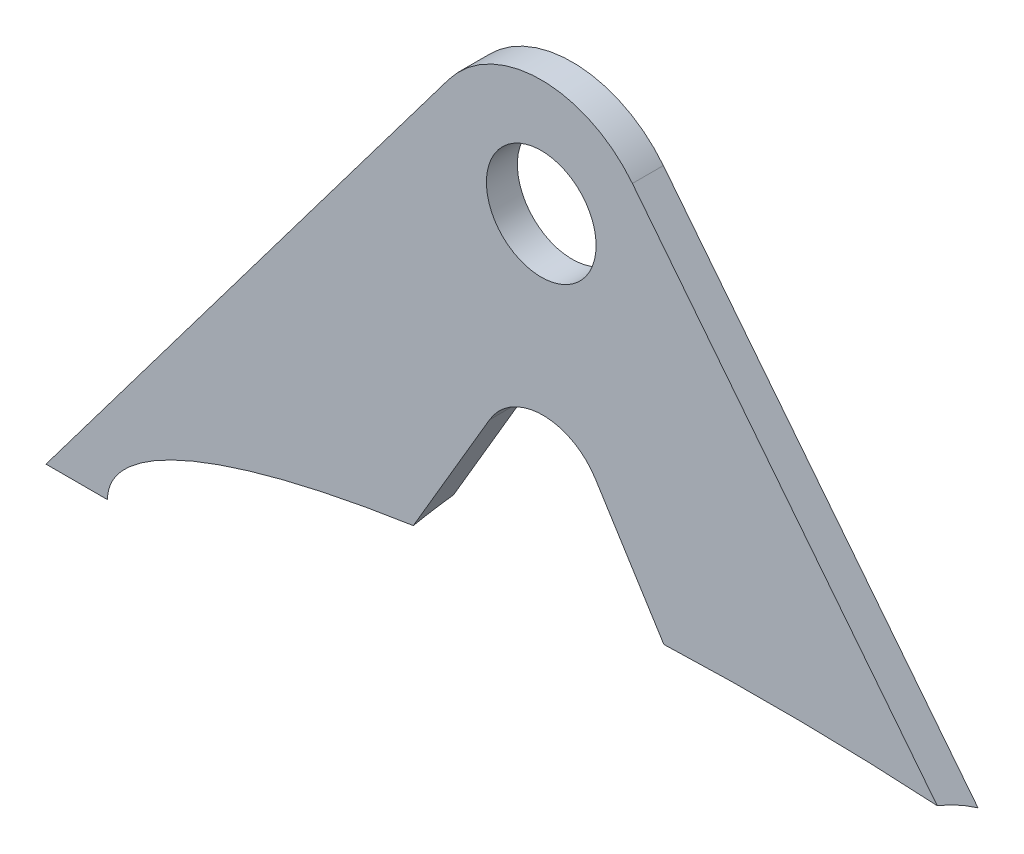
ISO-10303-21;
HEADER;
FILE_DESCRIPTION(('STEP AP214'),'2;1');
FILE_NAME('part.step','',(''),(''),'','','');
FILE_SCHEMA(('AUTOMOTIVE_DESIGN { 1 0 10303 214 1 1 1 1 }'));
ENDSEC;
DATA;
#1=APPLICATION_CONTEXT('core data for automotive mechanical design processes');
#2=APPLICATION_PROTOCOL_DEFINITION('international standard','automotive_design',2000,#1);
#3=PRODUCT_CONTEXT('',#1,'mechanical');
#4=PRODUCT('Part','Part','',(#3));
#5=PRODUCT_RELATED_PRODUCT_CATEGORY('part','',(#4));
#6=PRODUCT_DEFINITION_FORMATION('','',#4);
#7=PRODUCT_DEFINITION_CONTEXT('part definition',#1,'design');
#8=PRODUCT_DEFINITION('design','',#6,#7);
#9=PRODUCT_DEFINITION_SHAPE('','',#8);
#10=(LENGTH_UNIT() NAMED_UNIT(*) SI_UNIT(.MILLI.,.METRE.));
#11=(NAMED_UNIT(*) PLANE_ANGLE_UNIT() SI_UNIT($,.RADIAN.));
#12=(NAMED_UNIT(*) SI_UNIT($,.STERADIAN.) SOLID_ANGLE_UNIT());
#13=UNCERTAINTY_MEASURE_WITH_UNIT(LENGTH_MEASURE(1.E-05),#10,'distance_accuracy_value','');
#14=(GEOMETRIC_REPRESENTATION_CONTEXT(3) GLOBAL_UNCERTAINTY_ASSIGNED_CONTEXT((#13)) GLOBAL_UNIT_ASSIGNED_CONTEXT((#10,
#11,#12)) REPRESENTATION_CONTEXT('',''));
#15=CARTESIAN_POINT('',(0.,0.,0.));
#16=DIRECTION('',(0.,0.,1.));
#17=DIRECTION('',(1.,0.,0.));
#18=AXIS2_PLACEMENT_3D('',#15,#16,#17);
#19=CARTESIAN_POINT('',(26.6779072057898,38.1,2.54));
#20=DIRECTION('',(0.,0.,-1.));
#21=DIRECTION('',(-1.,0.,0.));
#22=AXIS2_PLACEMENT_3D('',#19,#20,#21);
#23=CYLINDRICAL_SURFACE('',#22,4.5);
#24=CARTESIAN_POINT('',(26.6779072057898,38.1,2.54));
#25=DIRECTION('',(0.,0.,1.));
#26=DIRECTION('',(1.,0.,0.));
#27=AXIS2_PLACEMENT_3D('',#24,#25,#26);
#28=CIRCLE('',#27,4.5);
#29=CARTESIAN_POINT('',(31.1779072057898,38.1,2.54));
#30=VERTEX_POINT('',#29);
#31=EDGE_CURVE('E286',#30,#30,#28,.T.);
#32=ORIENTED_EDGE('',*,*,#31,.T.);
#33=EDGE_LOOP('',(#32));
#34=FACE_BOUND('',#33,.T.);
#35=CARTESIAN_POINT('',(26.6779072057898,38.1,0.));
#36=DIRECTION('',(0.,0.,1.));
#37=DIRECTION('',(1.,0.,0.));
#38=AXIS2_PLACEMENT_3D('',#35,#36,#37);
#39=CIRCLE('',#38,4.5);
#40=CARTESIAN_POINT('',(31.1779072057898,38.1,0.));
#41=VERTEX_POINT('',#40);
#42=EDGE_CURVE('E251',#41,#41,#39,.T.);
#43=ORIENTED_EDGE('',*,*,#42,.F.);
#44=EDGE_LOOP('',(#43));
#45=FACE_BOUND('',#44,.T.);
#46=ADVANCED_FACE('F138',(#34,#45),#23,.F.);
#47=CARTESIAN_POINT('',(26.8205625712049,18.7856657582845,2.54));
#48=DIRECTION('',(0.,0.,-1.));
#49=DIRECTION('',(-1.,0.,0.));
#50=AXIS2_PLACEMENT_3D('',#47,#48,#49);
#51=CYLINDRICAL_SURFACE('',#50,5.08);
#52=CARTESIAN_POINT('',(26.8205625712049,18.7856657582845,2.54));
#53=DIRECTION('',(0.,0.,1.));
#54=DIRECTION('',(1.,0.,0.));
#55=AXIS2_PLACEMENT_3D('',#52,#53,#54);
#56=CIRCLE('',#55,5.08);
#57=CARTESIAN_POINT('',(22.4399836456593,21.3580048255665,2.54));
#58=VERTEX_POINT('',#57);
#59=CARTESIAN_POINT('',(31.1243263260033,21.4845576684734,2.54));
#60=VERTEX_POINT('',#59);
#61=EDGE_CURVE('E253',#58,#60,#56,.F.);
#62=ORIENTED_EDGE('',*,*,#61,.F.);
#63=DIRECTION('',(0.,0.,-1.));
#64=VECTOR('',#63,1.);
#65=CARTESIAN_POINT('',(22.4399836456593,21.3580048255665,2.54));
#66=LINE('',#65,#64);
#67=CARTESIAN_POINT('',(22.4399836456593,21.3580048255665,0.));
#68=VERTEX_POINT('',#67);
#69=EDGE_CURVE('E265',#68,#58,#66,.F.);
#70=ORIENTED_EDGE('',*,*,#69,.F.);
#71=CARTESIAN_POINT('',(26.8205625712049,18.7856657582845,0.));
#72=DIRECTION('',(0.,0.,1.));
#73=DIRECTION('',(1.,0.,0.));
#74=AXIS2_PLACEMENT_3D('',#71,#72,#73);
#75=CIRCLE('',#74,5.08);
#76=CARTESIAN_POINT('',(31.1243263260033,21.4845576684734,0.));
#77=VERTEX_POINT('',#76);
#78=EDGE_CURVE('E268',#77,#68,#75,.T.);
#79=ORIENTED_EDGE('',*,*,#78,.F.);
#80=DIRECTION('',(0.,0.,-1.));
#81=VECTOR('',#80,1.);
#82=CARTESIAN_POINT('',(31.1243263260033,21.4845576684734,2.54));
#83=LINE('',#82,#81);
#84=EDGE_CURVE('E266',#60,#77,#83,.T.);
#85=ORIENTED_EDGE('',*,*,#84,.F.);
#86=EDGE_LOOP('',(#62,#70,#79,#85));
#87=FACE_BOUND('',#86,.T.);
#88=ADVANCED_FACE('F301',(#87),#51,.F.);
#89=CARTESIAN_POINT('',(26.6779072057898,38.1,2.54));
#90=DIRECTION('',(0.,0.,-1.));
#91=DIRECTION('',(-1.,0.,0.));
#92=AXIS2_PLACEMENT_3D('',#89,#90,#91);
#93=CYLINDRICAL_SURFACE('',#92,9.52500000000007);
#94=CARTESIAN_POINT('',(26.6779072057898,38.1,0.));
#95=DIRECTION('',(0.,0.,1.));
#96=DIRECTION('',(1.,0.,0.));
#97=AXIS2_PLACEMENT_3D('',#94,#95,#96);
#98=CIRCLE('',#97,9.52500000000007);
#99=CARTESIAN_POINT('',(34.1566239330499,43.9986796076241,0.));
#100=VERTEX_POINT('',#99);
#101=CARTESIAN_POINT('',(19.0704334611226,43.8316636523963,0.));
#102=VERTEX_POINT('',#101);
#103=EDGE_CURVE('E233',#100,#102,#98,.T.);
#104=ORIENTED_EDGE('',*,*,#103,.T.);
#105=DIRECTION('',(0.,0.,-1.));
#106=VECTOR('',#105,1.);
#107=CARTESIAN_POINT('',(19.0704334611226,43.8316636523963,2.54));
#108=LINE('',#107,#106);
#109=CARTESIAN_POINT('',(19.0704334611226,43.8316636523963,2.54));
#110=VERTEX_POINT('',#109);
#111=EDGE_CURVE('E237',#110,#102,#108,.T.);
#112=ORIENTED_EDGE('',*,*,#111,.F.);
#113=CARTESIAN_POINT('',(26.6779072057898,38.1,2.54));
#114=DIRECTION('',(0.,0.,1.));
#115=DIRECTION('',(1.,0.,0.));
#116=AXIS2_PLACEMENT_3D('',#113,#114,#115);
#117=CIRCLE('',#116,9.52500000000007);
#118=CARTESIAN_POINT('',(34.1566239330499,43.9986796076241,2.54));
#119=VERTEX_POINT('',#118);
#120=EDGE_CURVE('E219',#119,#110,#117,.T.);
#121=ORIENTED_EDGE('',*,*,#120,.F.);
#122=DIRECTION('',(0.,0.,-1.));
#123=VECTOR('',#122,1.);
#124=CARTESIAN_POINT('',(34.1566239330499,43.9986796076241,2.54));
#125=LINE('',#124,#123);
#126=EDGE_CURVE('E225',#119,#100,#125,.T.);
#127=ORIENTED_EDGE('',*,*,#126,.T.);
#128=EDGE_LOOP('',(#104,#112,#121,#127));
#129=FACE_BOUND('',#128,.T.);
#130=ADVANCED_FACE('F235',(#129),#93,.T.);
#131=CARTESIAN_POINT('',(0.,0.,2.54));
#132=DIRECTION('',(0.,0.,1.));
#133=DIRECTION('',(1.,0.,0.));
#134=AXIS2_PLACEMENT_3D('',#131,#132,#133);
#135=PLANE('',#134);
#136=DIRECTION('',(-1.,0.,0.));
#137=VECTOR('',#136,1.);
#138=CARTESIAN_POINT('',(0.,0.,2.54));
#139=LINE('',#138,#137);
#140=CARTESIAN_POINT('',(-8.90722053061473,0.,2.54));
#141=VERTEX_POINT('',#140);
#142=CARTESIAN_POINT('',(-13.9534535495434,0.,2.54));
#143=VERTEX_POINT('',#142);
#144=EDGE_CURVE('E247',#141,#143,#139,.T.);
#145=ORIENTED_EDGE('',*,*,#144,.F.);
#146=CARTESIAN_POINT('',(45.4794242120375,-1.46403878387827E-13,2.54));
#147=DIRECTION('',(0.,0.,1.));
#148=DIRECTION('',(-1.,0.,0.));
#149=AXIS2_PLACEMENT_3D('',#146,#147,#148);
#150=ELLIPSE('',#149,54.3866447426522,12.7);
#151=CARTESIAN_POINT('',(16.1812802714202,10.6997115814329,2.54));
#152=VERTEX_POINT('',#151);
#153=EDGE_CURVE('E232',#141,#152,#150,.F.);
#154=ORIENTED_EDGE('',*,*,#153,.T.);
#155=DIRECTION('',(0.506365958126388,0.86231868613103,0.));
#156=VECTOR('',#155,1.);
#157=CARTESIAN_POINT('',(7.3602785788002,-4.32206163982509,2.54));
#158=LINE('',#157,#156);
#159=EDGE_CURVE('E259',#152,#58,#158,.T.);
#160=ORIENTED_EDGE('',*,*,#159,.T.);
#161=ORIENTED_EDGE('',*,*,#61,.T.);
#162=DIRECTION('',(-0.531277935076556,0.847197589527255,0.));
#163=VECTOR('',#162,1.);
#164=CARTESIAN_POINT('',(32.0094341160956,20.0731284772161,2.54));
#165=LINE('',#164,#163);
#166=CARTESIAN_POINT('',(36.7367003675268,12.5348357892486,2.54));
#167=VERTEX_POINT('',#166);
#168=EDGE_CURVE('E255',#167,#60,#165,.T.);
#169=ORIENTED_EDGE('',*,*,#168,.F.);
#170=CARTESIAN_POINT('',(59.1651211098144,12.2913351507788,2.54));
#171=VERTEX_POINT('',#170);
#172=EDGE_CURVE('E222',#167,#171,#150,.F.);
#173=ORIENTED_EDGE('',*,*,#172,.T.);
#174=DIRECTION('',(-0.61928394830699,0.7851671104735,0.));
#175=VECTOR('',#174,1.);
#176=CARTESIAN_POINT('',(42.4511070402585,33.48241263193,2.54));
#177=LINE('',#176,#175);
#178=EDGE_CURVE('E142',#171,#119,#177,.T.);
#179=ORIENTED_EDGE('',*,*,#178,.T.);
#180=ORIENTED_EDGE('',*,*,#120,.T.);
#181=DIRECTION('',(0.601749464818502,0.798684907576603,0.));
#182=VECTOR('',#181,1.);
#183=CARTESIAN_POINT('',(-8.90087427409117,6.70614441319893,2.54));
#184=LINE('',#183,#182);
#185=EDGE_CURVE('E245',#143,#110,#184,.T.);
#186=ORIENTED_EDGE('',*,*,#185,.F.);
#187=EDGE_LOOP('',(#145,#154,#160,#161,#169,#173,#179,#180,#186));
#188=FACE_BOUND('',#187,.T.);
#189=ORIENTED_EDGE('',*,*,#31,.F.);
#190=EDGE_LOOP('',(#189));
#191=FACE_BOUND('',#190,.T.);
#192=ADVANCED_FACE('F215',(#188,#191),#135,.T.);
#193=CARTESIAN_POINT('',(0.,0.,2.54));
#194=DIRECTION('',(0.,-1.,0.));
#195=DIRECTION('',(1.,0.,0.));
#196=AXIS2_PLACEMENT_3D('',#193,#194,#195);
#197=PLANE('',#196);
#198=DIRECTION('',(0.,0.,-1.));
#199=VECTOR('',#198,1.);
#200=CARTESIAN_POINT('',(-13.9534535495434,0.,2.54));
#201=LINE('',#200,#199);
#202=CARTESIAN_POINT('',(-13.9534535495434,0.,1.32813423899611));
#203=VERTEX_POINT('',#202);
#204=EDGE_CURVE('E239',#143,#203,#201,.T.);
#205=ORIENTED_EDGE('',*,*,#204,.T.);
#206=DIRECTION('',(-0.972353629454039,0.,-0.233513210092185));
#207=VECTOR('',#206,1.);
#208=CARTESIAN_POINT('',(181.980565129008,0.,48.3821897615537));
#209=LINE('',#208,#207);
#210=EDGE_CURVE('E157',#203,#141,#209,.F.);
#211=ORIENTED_EDGE('',*,*,#210,.T.);
#212=ORIENTED_EDGE('',*,*,#144,.T.);
#213=EDGE_LOOP('',(#205,#211,#212));
#214=FACE_BOUND('',#213,.T.);
#215=ADVANCED_FACE('F292',(#214),#197,.T.);
#216=CARTESIAN_POINT('',(0.,0.,0.));
#217=DIRECTION('',(0.,0.,1.));
#218=DIRECTION('',(1.,0.,0.));
#219=AXIS2_PLACEMENT_3D('',#216,#217,#218);
#220=PLANE('',#219);
#221=CARTESIAN_POINT('',(34.9028139301684,-1.53296825220854E-13,0.));
#222=DIRECTION('',(0.,0.,1.));
#223=DIRECTION('',(-1.,0.,0.));
#224=AXIS2_PLACEMENT_3D('',#221,#222,#223);
#225=ELLIPSE('',#224,54.3866447426522,12.7);
#226=CARTESIAN_POINT('',(-8.09407319420868,7.77698848301959,0.));
#227=VERTEX_POINT('',#226);
#228=CARTESIAN_POINT('',(16.9372472900203,11.9870897627185,0.));
#229=VERTEX_POINT('',#228);
#230=EDGE_CURVE('E148',#227,#229,#225,.F.);
#231=ORIENTED_EDGE('',*,*,#230,.F.);
#232=DIRECTION('',(0.601749464818502,0.798684907576603,0.));
#233=VECTOR('',#232,1.);
#234=CARTESIAN_POINT('',(-8.90087427409117,6.70614441319893,0.));
#235=LINE('',#234,#233);
#236=EDGE_CURVE('E258',#227,#102,#235,.T.);
#237=ORIENTED_EDGE('',*,*,#236,.T.);
#238=ORIENTED_EDGE('',*,*,#103,.F.);
#239=DIRECTION('',(-0.61928394830699,0.7851671104735,0.));
#240=VECTOR('',#239,1.);
#241=CARTESIAN_POINT('',(42.4511070402585,33.48241263193,0.));
#242=LINE('',#241,#240);
#243=CARTESIAN_POINT('',(59.9702302416764,11.2705671938374,0.));
#244=VERTEX_POINT('',#243);
#245=EDGE_CURVE('E228',#244,#100,#242,.T.);
#246=ORIENTED_EDGE('',*,*,#245,.F.);
#247=CARTESIAN_POINT('',(36.6371764001395,12.6935407903486,0.));
#248=VERTEX_POINT('',#247);
#249=EDGE_CURVE('E179',#248,#244,#225,.F.);
#250=ORIENTED_EDGE('',*,*,#249,.F.);
#251=DIRECTION('',(-0.531277935076556,0.847197589527255,0.));
#252=VECTOR('',#251,1.);
#253=CARTESIAN_POINT('',(32.0094341160956,20.0731284772161,0.));
#254=LINE('',#253,#252);
#255=EDGE_CURVE('E262',#248,#77,#254,.T.);
#256=ORIENTED_EDGE('',*,*,#255,.T.);
#257=ORIENTED_EDGE('',*,*,#78,.T.);
#258=DIRECTION('',(0.506365958126388,0.86231868613103,0.));
#259=VECTOR('',#258,1.);
#260=CARTESIAN_POINT('',(7.3602785788002,-4.32206163982509,0.));
#261=LINE('',#260,#259);
#262=EDGE_CURVE('E263',#229,#68,#261,.T.);
#263=ORIENTED_EDGE('',*,*,#262,.F.);
#264=EDGE_LOOP('',(#231,#237,#238,#246,#250,#256,#257,#263));
#265=FACE_BOUND('',#264,.T.);
#266=ORIENTED_EDGE('',*,*,#42,.T.);
#267=EDGE_LOOP('',(#266));
#268=FACE_BOUND('',#267,.T.);
#269=ADVANCED_FACE('F298',(#265,#268),#220,.F.);
#270=CARTESIAN_POINT('',(-8.90087427409117,6.70614441319893,2.54));
#271=DIRECTION('',(-0.798684907576603,0.601749464818502,0.));
#272=DIRECTION('',(-0.601749464818502,-0.798684907576603,0.));
#273=AXIS2_PLACEMENT_3D('',#270,#271,#272);
#274=PLANE('',#273);
#275=ORIENTED_EDGE('',*,*,#236,.F.);
#276=CARTESIAN_POINT('',(-13.9534535495436,-1.8513723960911E-13,-11.7329575441763));
#277=DIRECTION('',(-0.798684907576603,0.601749464818502,0.));
#278=DIRECTION('',(-0.558885438258992,-0.741792707263023,-0.37066244259899));
#279=AXIS2_PLACEMENT_3D('',#276,#277,#278);
#280=ELLIPSE('',#279,16.3532472684413,12.7);
#281=EDGE_CURVE('E249',#227,#203,#280,.F.);
#282=ORIENTED_EDGE('',*,*,#281,.T.);
#283=ORIENTED_EDGE('',*,*,#204,.F.);
#284=ORIENTED_EDGE('',*,*,#185,.T.);
#285=ORIENTED_EDGE('',*,*,#111,.T.);
#286=EDGE_LOOP('',(#275,#282,#283,#284,#285));
#287=FACE_BOUND('',#286,.T.);
#288=ADVANCED_FACE('F325',(#287),#274,.T.);
#289=CARTESIAN_POINT('',(42.4511070402585,33.48241263193,2.54));
#290=DIRECTION('',(-0.7851671104735,-0.61928394830699,0.));
#291=DIRECTION('',(0.61928394830699,-0.7851671104735,0.));
#292=AXIS2_PLACEMENT_3D('',#289,#290,#291);
#293=PLANE('',#292);
#294=CARTESIAN_POINT('',(68.8596516888507,-1.31166608539847E-13,8.15482140387714));
#295=DIRECTION('',(-0.7851671104735,-0.61928394830699,0.));
#296=DIRECTION('',(-0.577389463919438,0.732050650178867,-0.361556707208596));
#297=AXIS2_PLACEMENT_3D('',#294,#295,#296);
#298=ELLIPSE('',#297,16.6347922740877,12.7);
#299=EDGE_CURVE('E174',#244,#171,#298,.F.);
#300=ORIENTED_EDGE('',*,*,#299,.F.);
#301=ORIENTED_EDGE('',*,*,#245,.T.);
#302=ORIENTED_EDGE('',*,*,#126,.F.);
#303=ORIENTED_EDGE('',*,*,#178,.F.);
#304=EDGE_LOOP('',(#300,#301,#302,#303));
#305=FACE_BOUND('',#304,.T.);
#306=ADVANCED_FACE('F226',(#305),#293,.F.);
#307=CARTESIAN_POINT('',(32.0094341160956,20.0731284772161,2.54));
#308=DIRECTION('',(-0.847197589527255,-0.531277935076556,0.));
#309=DIRECTION('',(0.531277935076556,-0.847197589527255,0.));
#310=AXIS2_PLACEMENT_3D('',#307,#308,#309);
#311=PLANE('',#310);
#312=ORIENTED_EDGE('',*,*,#255,.F.);
#313=CARTESIAN_POINT('',(44.5973007244658,-1.46978772435915E-13,2.32815578916876));
#314=DIRECTION('',(-0.847197589527255,-0.531277935076556,0.));
#315=DIRECTION('',(-0.484115663178665,0.771990696053004,-0.411900946676115));
#316=AXIS2_PLACEMENT_3D('',#313,#314,#315);
#317=ELLIPSE('',#316,15.4168188680289,12.7);
#318=EDGE_CURVE('E183',#248,#167,#317,.F.);
#319=ORIENTED_EDGE('',*,*,#318,.T.);
#320=ORIENTED_EDGE('',*,*,#168,.T.);
#321=ORIENTED_EDGE('',*,*,#84,.T.);
#322=EDGE_LOOP('',(#312,#319,#320,#321));
#323=FACE_BOUND('',#322,.T.);
#324=ADVANCED_FACE('F327',(#323),#311,.T.);
#325=CARTESIAN_POINT('',(7.3602785788002,-4.32206163982509,2.54));
#326=DIRECTION('',(-0.86231868613103,0.506365958126388,0.));
#327=DIRECTION('',(-0.506365958126388,-0.86231868613103,0.));
#328=AXIS2_PLACEMENT_3D('',#325,#326,#327);
#329=PLANE('',#328);
#330=CARTESIAN_POINT('',(9.8982554526989,-1.69592697676698E-13,-6.0049086465488));
#331=DIRECTION('',(-0.86231868613103,0.506365958126388,0.));
#332=DIRECTION('',(-0.457518906358024,-0.779134331364913,-0.428516212077802));
#333=AXIS2_PLACEMENT_3D('',#330,#331,#332);
#334=ELLIPSE('',#333,15.1464788983916,12.7);
#335=EDGE_CURVE('E12',#229,#152,#334,.F.);
#336=ORIENTED_EDGE('',*,*,#335,.F.);
#337=ORIENTED_EDGE('',*,*,#262,.T.);
#338=ORIENTED_EDGE('',*,*,#69,.T.);
#339=ORIENTED_EDGE('',*,*,#159,.F.);
#340=EDGE_LOOP('',(#336,#337,#338,#339));
#341=FACE_BOUND('',#340,.T.);
#342=ADVANCED_FACE('F140',(#341),#329,.F.);
#343=CARTESIAN_POINT('',(184.946182897179,0.,36.0332986674874));
#344=DIRECTION('',(-0.972353629454039,0.,-0.233513210092185));
#345=DIRECTION('',(0.,1.,0.));
#346=AXIS2_PLACEMENT_3D('',#343,#344,#345);
#347=CYLINDRICAL_SURFACE('',#346,12.7);
#348=ORIENTED_EDGE('',*,*,#318,.F.);
#349=ORIENTED_EDGE('',*,*,#249,.T.);
#350=ORIENTED_EDGE('',*,*,#299,.T.);
#351=ORIENTED_EDGE('',*,*,#172,.F.);
#352=EDGE_LOOP('',(#348,#349,#350,#351));
#353=FACE_BOUND('',#352,.T.);
#354=ADVANCED_FACE('F315',(#353),#347,.F.);
#355=ORIENTED_EDGE('',*,*,#281,.F.);
#356=ORIENTED_EDGE('',*,*,#230,.T.);
#357=ORIENTED_EDGE('',*,*,#335,.T.);
#358=ORIENTED_EDGE('',*,*,#153,.F.);
#359=ORIENTED_EDGE('',*,*,#210,.F.);
#360=EDGE_LOOP('',(#355,#356,#357,#358,#359));
#361=FACE_BOUND('',#360,.T.);
#362=ADVANCED_FACE('F313',(#361),#347,.F.);
#363=CLOSED_SHELL('',(#46,#88,#130,#192,#215,#269,#288,#306,#324,#342,#354,#362));
#364=MANIFOLD_SOLID_BREP('B2',#363);
#365=ADVANCED_BREP_SHAPE_REPRESENTATION('',(#18,#364),#14);
#366=SHAPE_DEFINITION_REPRESENTATION(#9,#365);
ENDSEC;
END-ISO-10303-21;
